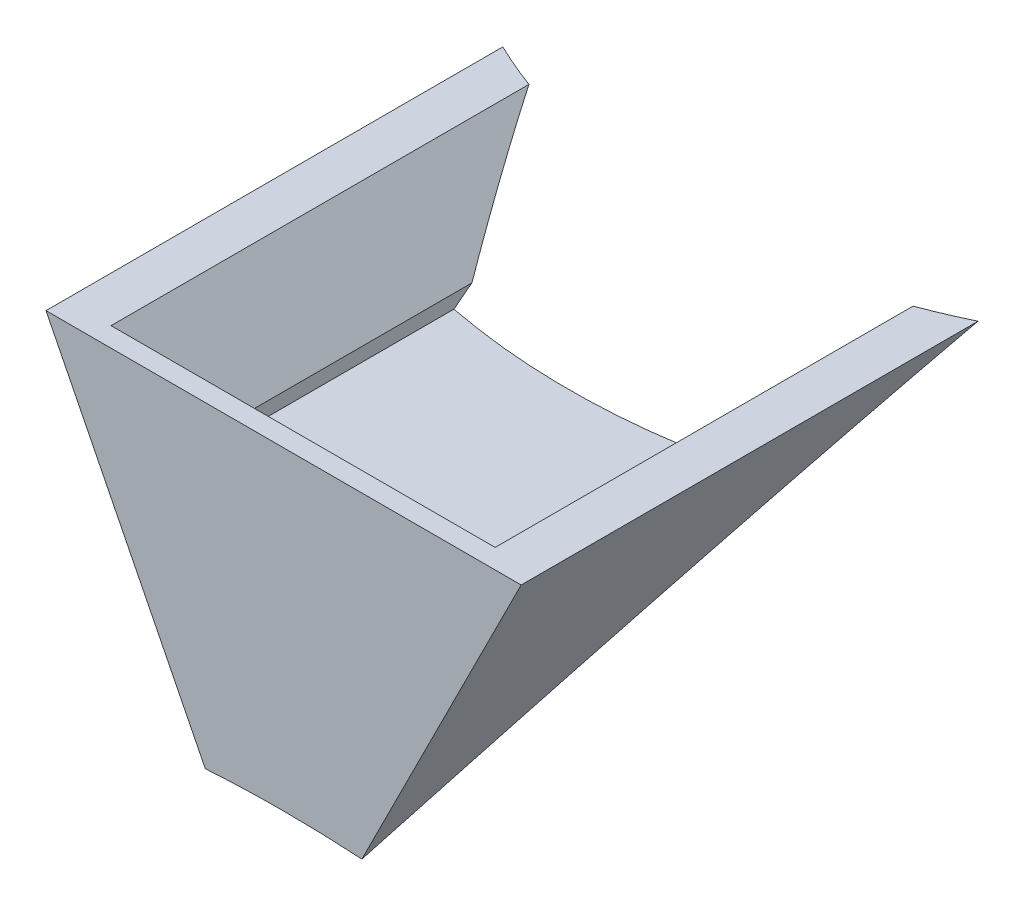
ISO-10303-21;
HEADER;
FILE_DESCRIPTION(('STEP AP214'),'2;1');
FILE_NAME('part.step','',(''),(''),'','','');
FILE_SCHEMA(('AUTOMOTIVE_DESIGN { 1 0 10303 214 1 1 1 1 }'));
ENDSEC;
DATA;
#1=APPLICATION_CONTEXT('core data for automotive mechanical design processes');
#2=APPLICATION_PROTOCOL_DEFINITION('international standard','automotive_design',2000,#1);
#3=PRODUCT_CONTEXT('',#1,'mechanical');
#4=PRODUCT('Part','Part','',(#3));
#5=PRODUCT_RELATED_PRODUCT_CATEGORY('part','',(#4));
#6=PRODUCT_DEFINITION_FORMATION('','',#4);
#7=PRODUCT_DEFINITION_CONTEXT('part definition',#1,'design');
#8=PRODUCT_DEFINITION('design','',#6,#7);
#9=PRODUCT_DEFINITION_SHAPE('','',#8);
#10=(LENGTH_UNIT() NAMED_UNIT(*) SI_UNIT(.MILLI.,.METRE.));
#11=(NAMED_UNIT(*) PLANE_ANGLE_UNIT() SI_UNIT($,.RADIAN.));
#12=(NAMED_UNIT(*) SI_UNIT($,.STERADIAN.) SOLID_ANGLE_UNIT());
#13=UNCERTAINTY_MEASURE_WITH_UNIT(LENGTH_MEASURE(1.E-05),#10,'distance_accuracy_value','');
#14=(GEOMETRIC_REPRESENTATION_CONTEXT(3) GLOBAL_UNCERTAINTY_ASSIGNED_CONTEXT((#13)) GLOBAL_UNIT_ASSIGNED_CONTEXT((#10,
#11,#12)) REPRESENTATION_CONTEXT('',''));
#15=CARTESIAN_POINT('',(0.,0.,0.));
#16=DIRECTION('',(0.,0.,1.));
#17=DIRECTION('',(1.,0.,0.));
#18=AXIS2_PLACEMENT_3D('',#15,#16,#17);
#19=CARTESIAN_POINT('',(36.5165123780825,61.1488138796035,74.4));
#20=DIRECTION('',(0.893572871010569,-0.44891817093311,0.));
#21=DIRECTION('',(0.44891817093311,0.893572871010569,0.));
#22=AXIS2_PLACEMENT_3D('',#19,#20,#21);
#23=PLANE('',#22);
#24=DIRECTION('',(0.44891817093311,0.893572871010569,0.));
#25=VECTOR('',#24,1.);
#26=CARTESIAN_POINT('',(36.5165123780825,61.1488138796035,146.));
#27=LINE('',#26,#25);
#28=CARTESIAN_POINT('',(12.0322438402475,12.4128090828477,146.));
#29=VERTEX_POINT('',#28);
#30=CARTESIAN_POINT('',(36.5165123780825,61.1488138796035,146.));
#31=VERTEX_POINT('',#30);
#32=EDGE_CURVE('E239',#29,#31,#27,.T.);
#33=ORIENTED_EDGE('',*,*,#32,.F.);
#34=CARTESIAN_POINT('',(12.0321680367807,12.4126581958356,146.0002));
#35=CARTESIAN_POINT('',(12.5688610544446,13.4809471440161,144.584175165571));
#36=CARTESIAN_POINT('',(13.1045962124579,14.5473294698912,143.166346857451));
#37=CARTESIAN_POINT('',(14.1739776630402,16.67593622915,140.326780206217));
#38=CARTESIAN_POINT('',(14.7076239496791,17.7381606507296,138.905041852021));
#39=CARTESIAN_POINT('',(15.7726581585626,19.8581142132651,136.05734215268));
#40=CARTESIAN_POINT('',(16.304046052333,20.9158432975426,134.631380754671));
#41=CARTESIAN_POINT('',(17.3643536281979,23.0263884838747,131.774914347619));
#42=CARTESIAN_POINT('',(17.8932733119516,24.0792045892317,130.34440934163));
#43=CARTESIAN_POINT('',(19.4753022142446,27.2282375305923,126.047437512643));
#44=CARTESIAN_POINT('',(20.5243921897442,29.3164540521178,123.173615521362));
#45=CARTESIAN_POINT('',(22.6097513121025,33.4673672000096,117.402880737035));
#46=CARTESIAN_POINT('',(23.6460202916624,35.5300634933671,114.505967643486));
#47=CARTESIAN_POINT('',(25.1889927466682,38.601354467497,110.139352616667));
#48=CARTESIAN_POINT('',(25.7015422874785,39.6215857576786,108.679894683172));
#49=CARTESIAN_POINT('',(26.7223170741325,41.6534408168525,105.753490729813));
#50=CARTESIAN_POINT('',(27.230542323348,42.6650645925567,104.286544715789));
#51=CARTESIAN_POINT('',(28.2421741587062,44.6787205816821,101.344530412456));
#52=CARTESIAN_POINT('',(28.7455809569398,45.6807532172711,99.8694624851887));
#53=CARTESIAN_POINT('',(29.747052352694,47.6741848230334,96.9103565123591));
#54=CARTESIAN_POINT('',(30.2451169651862,48.6655838230076,95.4263184919538));
#55=CARTESIAN_POINT('',(31.2356079436159,50.6371588774677,92.4473967751408));
#56=CARTESIAN_POINT('',(31.7280303323409,51.6173270153005,90.9525065120487));
#57=CARTESIAN_POINT('',(32.706165147445,53.5643070922068,87.9518899300106));
#58=CARTESIAN_POINT('',(33.191877643612,54.5311191701932,86.4461637240146));
#59=CARTESIAN_POINT('',(34.1558338999936,56.4498767864266,83.4225021751322));
#60=CARTESIAN_POINT('',(34.6340764118064,57.4018198397265,81.9045648543769));
#61=CARTESIAN_POINT('',(35.3450370599607,58.816988992328,79.617747034753));
#62=CARTESIAN_POINT('',(35.5809612917253,59.286596833509,78.8538074697439));
#63=CARTESIAN_POINT('',(36.050531589201,60.2212778199891,77.3224554309282));
#64=CARTESIAN_POINT('',(36.2841776406883,60.6863509369758,76.5550429354823));
#65=CARTESIAN_POINT('',(36.5166128552087,61.1490138796035,75.7858094345374));
#66=B_SPLINE_CURVE_WITH_KNOTS('',3,(#34,#35,#36,#37,#38,#39,#40,#41,#42,#43,#44,#45,#46,#47,#48,
#49,#50,#51,#52,#53,#54,#55,#56,#57,#58,#59,#60,#61,#62,#63,#64,#65),.UNSPECIFIED.,.F.,.F.,(4,2,
2,2,2,2,2,2,2,2,2,2,2,2,2,4),(0.,5.5596460292754,11.1193078307384,16.6790395231167,
22.2387674777242,33.3508071455111,44.4629916596974,50.0219486140888,55.5809012334323,
61.1396080317757,66.6982992477017,72.2606936289949,77.8230301136447,83.3862864520147,
86.1680230525511,88.94977700966),.UNSPECIFIED.);
#67=CARTESIAN_POINT('',(36.5165123780824,61.1488138796035,75.7861419614044));
#68=VERTEX_POINT('',#67);
#69=EDGE_CURVE('E205',#29,#68,#66,.T.);
#70=ORIENTED_EDGE('',*,*,#69,.T.);
#71=DIRECTION('',(0.,0.,1.));
#72=VECTOR('',#71,1.);
#73=CARTESIAN_POINT('',(36.5165123780825,61.1488138796035,74.4));
#74=LINE('',#73,#72);
#75=EDGE_CURVE('E49',#68,#31,#74,.T.);
#76=ORIENTED_EDGE('',*,*,#75,.T.);
#77=EDGE_LOOP('',(#33,#70,#76));
#78=FACE_BOUND('',#77,.T.);
#79=ADVANCED_FACE('F40',(#78),#23,.T.);
#80=CARTESIAN_POINT('',(-36.5165123780825,61.1488138796035,74.4));
#81=DIRECTION('',(-0.893572871010569,-0.44891817093311,0.));
#82=DIRECTION('',(0.44891817093311,-0.893572871010569,0.));
#83=AXIS2_PLACEMENT_3D('',#80,#81,#82);
#84=PLANE('',#83);
#85=DIRECTION('',(0.,0.,1.));
#86=VECTOR('',#85,1.);
#87=CARTESIAN_POINT('',(-36.5165123780825,61.1488138796035,74.4));
#88=LINE('',#87,#86);
#89=CARTESIAN_POINT('',(-36.5165123780824,61.1488138796035,75.7861419614044));
#90=VERTEX_POINT('',#89);
#91=CARTESIAN_POINT('',(-36.5165123780825,61.1488138796035,146.));
#92=VERTEX_POINT('',#91);
#93=EDGE_CURVE('E245',#90,#92,#88,.T.);
#94=ORIENTED_EDGE('',*,*,#93,.F.);
#95=CARTESIAN_POINT('',(-36.5166128552087,61.1490138796035,75.7858094345374));
#96=CARTESIAN_POINT('',(-36.2841776406883,60.6863509369758,76.5550429354823));
#97=CARTESIAN_POINT('',(-36.050531589201,60.2212778199891,77.3224554309282));
#98=CARTESIAN_POINT('',(-35.5809612917253,59.286596833509,78.8538074697439));
#99=CARTESIAN_POINT('',(-35.3450370599607,58.816988992328,79.617747034753));
#100=CARTESIAN_POINT('',(-34.6340764118064,57.4018198397265,81.9045648543769));
#101=CARTESIAN_POINT('',(-34.1558338999936,56.4498767864265,83.4225021751322));
#102=CARTESIAN_POINT('',(-33.191877643612,54.5311191701932,86.4461637240146));
#103=CARTESIAN_POINT('',(-32.706165147445,53.5643070922068,87.9518899300106));
#104=CARTESIAN_POINT('',(-31.7280303323409,51.6173270153005,90.9525065120487));
#105=CARTESIAN_POINT('',(-31.2356079436159,50.6371588774677,92.4473967751409));
#106=CARTESIAN_POINT('',(-30.2451169651862,48.6655838230076,95.4263184919538));
#107=CARTESIAN_POINT('',(-29.747052352694,47.6741848230334,96.9103565123591));
#108=CARTESIAN_POINT('',(-28.7455809569398,45.6807532172711,99.8694624851888));
#109=CARTESIAN_POINT('',(-28.2421741587062,44.6787205816821,101.344530412456));
#110=CARTESIAN_POINT('',(-27.230542323348,42.6650645925567,104.286544715789));
#111=CARTESIAN_POINT('',(-26.7223170741325,41.6534408168525,105.753490729813));
#112=CARTESIAN_POINT('',(-25.7015422874785,39.6215857576786,108.679894683172));
#113=CARTESIAN_POINT('',(-25.1889927466682,38.601354467497,110.139352616667));
#114=CARTESIAN_POINT('',(-23.6460202916624,35.5300634933671,114.505967643486));
#115=CARTESIAN_POINT('',(-22.6097513121025,33.4673672000096,117.402880737035));
#116=CARTESIAN_POINT('',(-20.5243921897442,29.3164540521178,123.173615521362));
#117=CARTESIAN_POINT('',(-19.4753022142446,27.2282375305923,126.047437512643));
#118=CARTESIAN_POINT('',(-17.8932733119516,24.0792045892317,130.34440934163));
#119=CARTESIAN_POINT('',(-17.3643536281979,23.0263884838747,131.774914347619));
#120=CARTESIAN_POINT('',(-16.304046052333,20.9158432975426,134.631380754671));
#121=CARTESIAN_POINT('',(-15.7726581585626,19.8581142132651,136.05734215268));
#122=CARTESIAN_POINT('',(-14.7076239496791,17.7381606507296,138.905041852021));
#123=CARTESIAN_POINT('',(-14.1739776630402,16.67593622915,140.326780206217));
#124=CARTESIAN_POINT('',(-13.1045962124579,14.5473294698912,143.166346857451));
#125=CARTESIAN_POINT('',(-12.5688610544446,13.4809471440161,144.584175165571));
#126=CARTESIAN_POINT('',(-12.0321680367807,12.4126581958356,146.0002));
#127=B_SPLINE_CURVE_WITH_KNOTS('',3,(#95,#96,#97,#98,#99,#100,#101,#102,#103,#104,#105,#106,
#107,#108,#109,#110,#111,#112,#113,#114,#115,#116,#117,#118,#119,#120,#121,#122,#123,#124,#125,
#126),.UNSPECIFIED.,.F.,.F.,(4,2,2,2,2,2,2,2,2,2,2,2,2,2,2,4),(0.,2.78175395710883,
5.56349055764522,11.1267468960152,16.689083380665,22.2514777619583,27.8101689778842,
33.3688757762276,38.9278283955712,44.4867853499626,55.5989698641489,66.7110095319357,
72.2707374865433,77.8304691789216,83.3901309803846,88.94977700966),.UNSPECIFIED.);
#128=CARTESIAN_POINT('',(-12.0322438402475,12.4128090828477,146.));
#129=VERTEX_POINT('',#128);
#130=EDGE_CURVE('E216',#90,#129,#127,.T.);
#131=ORIENTED_EDGE('',*,*,#130,.T.);
#132=DIRECTION('',(0.44891817093311,-0.893572871010569,0.));
#133=VECTOR('',#132,1.);
#134=CARTESIAN_POINT('',(-36.5165123780825,61.1488138796035,146.));
#135=LINE('',#134,#133);
#136=EDGE_CURVE('E243',#92,#129,#135,.T.);
#137=ORIENTED_EDGE('',*,*,#136,.F.);
#138=EDGE_LOOP('',(#94,#131,#137));
#139=FACE_BOUND('',#138,.T.);
#140=ADVANCED_FACE('F42',(#139),#84,.T.);
#141=CARTESIAN_POINT('',(0.,0.,146.));
#142=DIRECTION('',(0.,0.,1.));
#143=DIRECTION('',(1.,0.,0.));
#144=AXIS2_PLACEMENT_3D('',#141,#142,#143);
#145=PLANE('',#144);
#146=ORIENTED_EDGE('',*,*,#136,.T.);
#147=CARTESIAN_POINT('',(-101.235445651522,-11.9429442553645,146.));
#148=CARTESIAN_POINT('',(-99.7269255141927,-11.2712843398713,146.));
#149=CARTESIAN_POINT('',(-98.2146348679975,-10.6080609369352,146.));
#150=CARTESIAN_POINT('',(-95.1822341406342,-9.2996354057877,146.));
#151=CARTESIAN_POINT('',(-93.6621238600302,-8.65443373993697,146.));
#152=CARTESIAN_POINT('',(-90.6134850529939,-7.38306863157186,146.));
#153=CARTESIAN_POINT('',(-89.0849544334163,-6.75691020080287,146.));
#154=CARTESIAN_POINT('',(-86.0196831861346,-5.5250821414557,146.));
#155=CARTESIAN_POINT('',(-84.4829426124136,-4.91941237834947,146.));
#156=CARTESIAN_POINT('',(-79.8502611864355,-3.13130673170069,146.));
#157=CARTESIAN_POINT('',(-76.7414963606845,-1.98181090146236,146.));
#158=CARTESIAN_POINT('',(-70.4891658547942,0.217771821168926,146.));
#159=CARTESIAN_POINT('',(-67.3456027051401,1.26786588956297,146.));
#160=CARTESIAN_POINT('',(-61.0559960211285,3.24576189099809,146.));
#161=CARTESIAN_POINT('',(-57.9103186251433,4.17472257915209,146.));
#162=CARTESIAN_POINT('',(-51.5851273331574,5.91008633587676,146.));
#163=CARTESIAN_POINT('',(-48.4056125686174,6.71648625039304,146.));
#164=CARTESIAN_POINT('',(-42.0185507862757,8.19276707729138,146.));
#165=CARTESIAN_POINT('',(-38.8110398520496,8.86280255314277,146.));
#166=CARTESIAN_POINT('',(-33.979497110409,9.75694638090364,146.));
#167=CARTESIAN_POINT('',(-32.3655935692349,10.0365107925034,146.));
#168=CARTESIAN_POINT('',(-29.1316214868001,10.5572949190018,146.));
#169=CARTESIAN_POINT('',(-27.511553025052,10.7985151267437,146.));
#170=CARTESIAN_POINT('',(-23.2415317172124,11.381059860299,146.));
#171=CARTESIAN_POINT('',(-20.5870023666651,11.6894589256714,146.));
#172=CARTESIAN_POINT('',(-15.2675297798313,12.1960458132916,146.));
#173=CARTESIAN_POINT('',(-12.6025868390442,12.3942367402969,146.));
#174=CARTESIAN_POINT('',(-7.26624970408321,12.6773148955499,146.));
#175=CARTESIAN_POINT('',(-4.5948546113315,12.7621853071541,146.));
#176=CARTESIAN_POINT('',(0.749142105722115,12.8171773848548,146.));
#177=CARTESIAN_POINT('',(3.42174374075176,12.7872980097506,146.));
#178=CARTESIAN_POINT('',(8.7711414910762,12.6130212891526,146.));
#179=CARTESIAN_POINT('',(11.4479264875827,12.4682840727681,146.));
#180=CARTESIAN_POINT('',(16.7929636939864,12.0662197930451,146.));
#181=CARTESIAN_POINT('',(19.4612159798766,11.8088937352604,146.));
#182=CARTESIAN_POINT('',(24.784556250901,11.18570733156,146.));
#183=CARTESIAN_POINT('',(27.4396461012146,10.8198628377314,146.));
#184=CARTESIAN_POINT('',(32.7336167015871,9.98494686571263,146.));
#185=CARTESIAN_POINT('',(35.3724967520174,9.51587096370305,146.));
#186=CARTESIAN_POINT('',(40.0284826154804,8.59944414842753,146.));
#187=CARTESIAN_POINT('',(42.0494915976466,8.17174913616911,146.));
#188=CARTESIAN_POINT('',(46.0792484672925,7.26192826606441,146.));
#189=CARTESIAN_POINT('',(48.0879959299772,6.77980053357491,146.));
#190=CARTESIAN_POINT('',(54.0951687793045,5.25650928243711,146.));
#191=CARTESIAN_POINT('',(58.0742830877898,4.13848597820889,146.));
#192=CARTESIAN_POINT('',(65.9845531118227,1.72164690538786,146.));
#193=CARTESIAN_POINT('',(69.9156074422803,0.42250319668737,146.));
#194=CARTESIAN_POINT('',(77.7228779161781,-2.33017416972921,146.));
#195=CARTESIAN_POINT('',(81.5990970098757,-3.78369948529851,146.));
#196=CARTESIAN_POINT('',(87.3733662577268,-6.06280711722164,146.));
#197=CARTESIAN_POINT('',(89.2911876790609,-6.83886720137358,146.));
#198=CARTESIAN_POINT('',(93.1141829528185,-8.42153413166582,146.));
#199=CARTESIAN_POINT('',(95.0193569406113,-9.22814065023709,146.));
#200=CARTESIAN_POINT('',(98.8176422067613,-10.8696129769058,146.));
#201=CARTESIAN_POINT('',(100.710752554456,-11.7044809346382,146.));
#202=CARTESIAN_POINT('',(104.485248777022,-13.4002585720275,146.));
#203=CARTESIAN_POINT('',(106.366634738742,-14.2611680585018,146.));
#204=CARTESIAN_POINT('',(110.108942607947,-16.0027356458791,146.));
#205=CARTESIAN_POINT('',(111.969919687119,-16.8832753015152,146.));
#206=CARTESIAN_POINT('',(115.681297483109,-18.6663827265574,146.));
#207=CARTESIAN_POINT('',(117.531698135875,-19.5689506291953,146.));
#208=CARTESIAN_POINT('',(121.221899201266,-21.3941939740792,146.));
#209=CARTESIAN_POINT('',(123.06170244719,-22.316863693241,146.));
#210=CARTESIAN_POINT('',(126.731683053166,-24.1810479024655,146.));
#211=CARTESIAN_POINT('',(128.561860647996,-25.1225619301837,146.));
#212=CARTESIAN_POINT('',(130.387495482645,-26.0727668387425,146.));
#213=B_SPLINE_CURVE_WITH_KNOTS('',3,(#147,#148,#149,#150,#151,#152,#153,#154,#155,#156,#157,
#158,#159,#160,#161,#162,#163,#164,#165,#166,#167,#168,#169,#170,#171,#172,#173,#174,#175,#176,
#177,#178,#179,#180,#181,#182,#183,#184,#185,#186,#187,#188,#189,#190,#191,#192,#193,#194,#195,
#196,#197,#198,#199,#200,#201,#202,#203,#204,#205,#206,#207,#208,#209,#210,#211,#212),
.UNSPECIFIED.,.F.,.F.,(4,2,2,2,2,2,2,2,2,2,2,2,2,2,2,2,2,2,2,2,2,2,2,2,2,2,2,2,2,2,2,2,4),(0.,
4.95386351296243,9.9078540043481,14.8631371848483,19.8183878227702,29.7602195135498,
39.701332936464,49.5390097813912,59.3769397522985,69.2036559582686,74.1170739887055,
79.0304288612248,87.0452359389332,95.0598172139661,103.075587712171,111.091430942928,
119.13108235548,127.17066196574,135.209067753278,143.247818081141,149.444358297442,
155.641111985486,168.035357388622,180.452342764818,192.868657519246,199.075124821961,
205.281525587574,211.488399492812,217.695227365182,223.871420351261,230.047650701606,
236.222145052466,242.396488097561),.UNSPECIFIED.);
#214=EDGE_CURVE('E210',#129,#29,#213,.T.);
#215=ORIENTED_EDGE('',*,*,#214,.T.);
#216=ORIENTED_EDGE('',*,*,#32,.T.);
#217=DIRECTION('',(-1.,0.,0.));
#218=VECTOR('',#217,1.);
#219=CARTESIAN_POINT('',(0.,61.1488138796035,146.));
#220=LINE('',#219,#218);
#221=EDGE_CURVE('E242',#31,#92,#220,.T.);
#222=ORIENTED_EDGE('',*,*,#221,.T.);
#223=EDGE_LOOP('',(#146,#215,#216,#222));
#224=FACE_BOUND('',#223,.T.);
#225=ADVANCED_FACE('F222',(#224),#145,.T.);
#226=CARTESIAN_POINT('',(-19.487098975901,49.1363230869728,74.2));
#227=DIRECTION('',(-1.,0.,0.));
#228=DIRECTION('',(0.,0.,1.));
#229=AXIS2_PLACEMENT_3D('',#226,#227,#228);
#230=PLANE('',#229);
#231=CARTESIAN_POINT('',(-19.487098975901,78.1563062293105,59.236449826861));
#232=CARTESIAN_POINT('',(-19.487098975901,77.5261153437329,60.0854498763022));
#233=CARTESIAN_POINT('',(-19.487098975901,76.8950801668723,60.9338225551862));
#234=CARTESIAN_POINT('',(-19.487098975901,75.6314947866218,62.6294380032252));
#235=CARTESIAN_POINT('',(-19.487098975901,74.9989445843582,63.4766807732194));
#236=CARTESIAN_POINT('',(-19.487098975901,73.0992847851647,66.0168974487471));
#237=CARTESIAN_POINT('',(-19.487098975901,71.8301615954077,67.7083656431193));
#238=CARTESIAN_POINT('',(-19.487098975901,69.2876187220716,71.0880380398328));
#239=CARTESIAN_POINT('',(-19.487098975901,68.0141990872162,72.7762422788497));
#240=CARTESIAN_POINT('',(-19.487098975901,65.4638381843382,76.1499906840443));
#241=CARTESIAN_POINT('',(-19.487098975901,64.1868969127779,77.8355348475471));
#242=CARTESIAN_POINT('',(-19.487098975901,61.6301303141819,81.204383332828));
#243=CARTESIAN_POINT('',(-19.487098975901,60.3503050424662,82.8876876966005));
#244=CARTESIAN_POINT('',(-19.487098975901,57.7882200063138,86.2524429039457));
#245=CARTESIAN_POINT('',(-19.487098975901,56.5059602413441,87.9338937471126));
#246=CARTESIAN_POINT('',(-19.487098975901,52.6561066826786,92.9759161479314));
#247=CARTESIAN_POINT('',(-19.487098975901,50.0854469312803,96.3341466437141));
#248=CARTESIAN_POINT('',(-19.487098975901,44.3767647000313,103.778120563267));
#249=CARTESIAN_POINT('',(-19.487098975901,41.237303930421,107.862760437191));
#250=CARTESIAN_POINT('',(-19.487098975901,34.952108151018,116.027211218963));
#251=CARTESIAN_POINT('',(-19.487098975901,31.8063731385473,120.107022124747));
#252=CARTESIAN_POINT('',(-19.487098975901,25.5102754124458,128.26307209927));
#253=CARTESIAN_POINT('',(-19.487098975901,22.3599126978781,132.339311167285));
#254=CARTESIAN_POINT('',(-19.487098975901,16.0556804892631,140.489076790905));
#255=CARTESIAN_POINT('',(-19.487098975901,12.9018109949063,144.56260334627));
#256=CARTESIAN_POINT('',(-19.487098975901,6.59122151714518,152.707716339159));
#257=CARTESIAN_POINT('',(-19.487098975901,3.43450142161968,156.779302689804));
#258=CARTESIAN_POINT('',(-19.487098975901,-2.88109276417862,164.920804823749));
#259=CARTESIAN_POINT('',(-19.487098975901,-6.03996685460972,168.990720606925));
#260=CARTESIAN_POINT('',(-19.487098975901,-12.3594319577289,177.129193490062));
#261=CARTESIAN_POINT('',(-19.487098975901,-15.5200229636822,181.197750595253));
#262=CARTESIAN_POINT('',(-19.487098975901,-21.8426313178182,189.333755303868));
#263=CARTESIAN_POINT('',(-19.487098975901,-25.0046486657607,193.401202907479));
#264=CARTESIAN_POINT('',(-19.487098975901,-28.1672282805637,197.468213106563));
#265=B_SPLINE_CURVE_WITH_KNOTS('',3,(#231,#232,#233,#234,#235,#236,#237,#238,#239,#240,#241,
#242,#243,#244,#245,#246,#247,#248,#249,#250,#251,#252,#253,#254,#255,#256,#257,#258,#259,#260,
#261,#262,#263,#264),.UNSPECIFIED.,.F.,.F.,(4,2,2,2,2,2,2,2,2,2,2,2,2,2,2,2,4),(0.,
3.17198140364623,6.34396044991013,12.6878964056521,19.0317606583096,25.3756312861033,
31.7193812464243,38.0631325958425,50.7506764858875,66.2059090936675,81.6611483000004,
97.1163906358588,112.571634335535,128.027514996498,143.483396793393,158.939218394233,
174.395037392579),.UNSPECIFIED.);
#266=CARTESIAN_POINT('',(-19.487098975901,49.1363230869727,97.5709317566812));
#267=VERTEX_POINT('',#266);
#268=CARTESIAN_POINT('',(-19.487098975901,47.0213319904168,100.329598667714));
#269=VERTEX_POINT('',#268);
#270=EDGE_CURVE('E55',#267,#269,#265,.T.);
#271=ORIENTED_EDGE('',*,*,#270,.F.);
#272=DIRECTION('',(0.,0.,1.));
#273=VECTOR('',#272,1.);
#274=CARTESIAN_POINT('',(-19.487098975901,49.1363230869728,74.2));
#275=LINE('',#274,#273);
#276=CARTESIAN_POINT('',(-19.487098975901,49.1363230869728,143.));
#277=VERTEX_POINT('',#276);
#278=EDGE_CURVE('E248',#267,#277,#275,.T.);
#279=ORIENTED_EDGE('',*,*,#278,.T.);
#280=DIRECTION('',(0.,-1.,0.));
#281=VECTOR('',#280,1.);
#282=CARTESIAN_POINT('',(-19.487098975901,49.1363230869728,143.));
#283=LINE('',#282,#281);
#284=CARTESIAN_POINT('',(-19.487098975901,47.0213319904168,143.));
#285=VERTEX_POINT('',#284);
#286=EDGE_CURVE('E257',#277,#285,#283,.T.);
#287=ORIENTED_EDGE('',*,*,#286,.T.);
#288=DIRECTION('',(0.,0.,1.));
#289=VECTOR('',#288,1.);
#290=CARTESIAN_POINT('',(-19.487098975901,47.0213319904168,74.2));
#291=LINE('',#290,#289);
#292=EDGE_CURVE('E278',#269,#285,#291,.T.);
#293=ORIENTED_EDGE('',*,*,#292,.F.);
#294=EDGE_LOOP('',(#271,#279,#287,#293));
#295=FACE_BOUND('',#294,.T.);
#296=ADVANCED_FACE('F226',(#295),#230,.F.);
#297=CARTESIAN_POINT('',(-29.5165123781139,61.1488138795835,74.2));
#298=DIRECTION('',(-0.767623688512181,-0.640900829173246,0.));
#299=DIRECTION('',(0.640900829173246,-0.767623688512181,0.));
#300=AXIS2_PLACEMENT_3D('',#297,#298,#299);
#301=PLANE('',#300);
#302=CARTESIAN_POINT('',(-29.5166793611914,61.1490138795835,78.7763769512038));
#303=CARTESIAN_POINT('',(-29.1162450962017,60.6694032853913,79.5818620249337));
#304=CARTESIAN_POINT('',(-28.7132638004948,60.186742045881,80.3842526119776));
#305=CARTESIAN_POINT('',(-27.902494651338,59.2156626269162,81.9830870379457));
#306=CARTESIAN_POINT('',(-27.4947068488426,58.7272445084913,82.7795309397656));
#307=CARTESIAN_POINT('',(-26.2647706117741,57.2541177032861,85.1599085746357));
#308=CARTESIAN_POINT('',(-25.4358356786641,56.2612806496793,86.7353171619305));
#309=CARTESIAN_POINT('',(-23.7619357819605,54.2564069556238,89.8650797601419));
#310=CARTESIAN_POINT('',(-22.9169717334579,53.2443714112036,91.41943496435));
#311=CARTESIAN_POINT('',(-21.638646587056,51.7132879434778,93.7366832969033));
#312=CARTESIAN_POINT('',(-21.2106666103389,51.2006851297776,94.5068214963811));
#313=CARTESIAN_POINT('',(-20.3513048791141,50.1714051041301,96.0424554510079));
#314=CARTESIAN_POINT('',(-19.9199231456682,49.6547279174089,96.8079512348484));
#315=CARTESIAN_POINT('',(-19.4869319928235,49.1361230869728,97.5712261123492));
#316=B_SPLINE_CURVE_WITH_KNOTS('',3,(#302,#303,#304,#305,#306,#307,#308,#309,#310,#311,#312,
#313,#314,#315),.UNSPECIFIED.,.F.,.F.,(4,2,2,2,2,2,4),(0.,3.05817723988801,6.1163220886633,
12.2309822740365,18.3452944220146,21.4032749017773,24.4612364629934),.UNSPECIFIED.);
#317=CARTESIAN_POINT('',(-29.5165123781139,61.1488138795835,78.7767128451661));
#318=VERTEX_POINT('',#317);
#319=EDGE_CURVE('E200',#318,#267,#316,.T.);
#320=ORIENTED_EDGE('',*,*,#319,.F.);
#321=DIRECTION('',(0.,0.,1.));
#322=VECTOR('',#321,1.);
#323=CARTESIAN_POINT('',(-29.5165123781139,61.1488138795835,74.2));
#324=LINE('',#323,#322);
#325=CARTESIAN_POINT('',(-29.5165123781139,61.1488138795835,143.));
#326=VERTEX_POINT('',#325);
#327=EDGE_CURVE('E280',#318,#326,#324,.T.);
#328=ORIENTED_EDGE('',*,*,#327,.T.);
#329=DIRECTION('',(0.640900829173246,-0.767623688512181,0.));
#330=VECTOR('',#329,1.);
#331=CARTESIAN_POINT('',(-29.5165123781139,61.1488138795835,143.));
#332=LINE('',#331,#330);
#333=EDGE_CURVE('E275',#326,#277,#332,.T.);
#334=ORIENTED_EDGE('',*,*,#333,.T.);
#335=ORIENTED_EDGE('',*,*,#278,.F.);
#336=EDGE_LOOP('',(#320,#328,#334,#335));
#337=FACE_BOUND('',#336,.T.);
#338=ADVANCED_FACE('F307',(#337),#301,.F.);
#339=CARTESIAN_POINT('',(20.512901024099,49.1363230869728,74.2));
#340=DIRECTION('',(0.800184028833963,-0.59975454979437,0.));
#341=DIRECTION('',(0.59975454979437,0.800184028833963,0.));
#342=AXIS2_PLACEMENT_3D('',#339,#340,#341);
#343=PLANE('',#342);
#344=CARTESIAN_POINT('',(20.5127511199449,49.1361230869727,97.3607298917346));
#345=CARTESIAN_POINT('',(20.9001752747153,49.653018909002,96.6030785201092));
#346=CARTESIAN_POINT('',(21.2862942844788,50.1681734250417,95.8435730652123));
#347=CARTESIAN_POINT('',(22.0557706170823,51.1947978535286,94.3206768771763));
#348=CARTESIAN_POINT('',(22.439127926352,51.7062677478704,93.5572861249773));
#349=CARTESIAN_POINT('',(23.584665076525,53.2346271947786,91.2613509963163));
#350=CARTESIAN_POINT('',(24.3424720152406,54.2456824831591,89.7227275764417));
#351=CARTESIAN_POINT('',(25.8450342472187,56.2503797393452,86.6277274848075));
#352=CARTESIAN_POINT('',(26.589788959003,57.2440209313512,85.0713500271773));
#353=CARTESIAN_POINT('',(27.6959273366422,58.7198150937642,82.722149281497));
#354=CARTESIAN_POINT('',(28.062845106323,59.2093515871424,81.9365615318271));
#355=CARTESIAN_POINT('',(28.7927565498586,60.1831891008063,80.3603242862441));
#356=CARTESIAN_POINT('',(29.1557501900155,60.6674900761326,79.569674746956));
#357=CARTESIAN_POINT('',(29.5166622821685,61.1490138795835,78.7763833505318));
#358=B_SPLINE_CURVE_WITH_KNOTS('',3,(#344,#345,#346,#347,#348,#349,#350,#351,#352,#353,#354,
#355,#356,#357),.UNSPECIFIED.,.F.,.F.,(4,2,2,2,2,2,4),(0.,2.98693602881047,5.97388672469401,
11.9465410851712,17.9194608550667,20.906536681443,23.893638138708),.UNSPECIFIED.);
#359=CARTESIAN_POINT('',(20.512901024099,49.1363230869727,97.3604367386416));
#360=VERTEX_POINT('',#359);
#361=CARTESIAN_POINT('',(29.5165123780145,61.1488138795835,78.7767128452034));
#362=VERTEX_POINT('',#361);
#363=EDGE_CURVE('E170',#360,#362,#358,.T.);
#364=ORIENTED_EDGE('',*,*,#363,.F.);
#365=DIRECTION('',(0.,0.,1.));
#366=VECTOR('',#365,1.);
#367=CARTESIAN_POINT('',(20.512901024099,49.1363230869728,74.2));
#368=LINE('',#367,#366);
#369=CARTESIAN_POINT('',(20.512901024099,49.1363230869728,143.));
#370=VERTEX_POINT('',#369);
#371=EDGE_CURVE('E284',#360,#370,#368,.T.);
#372=ORIENTED_EDGE('',*,*,#371,.T.);
#373=DIRECTION('',(0.59975454979437,0.800184028833963,0.));
#374=VECTOR('',#373,1.);
#375=CARTESIAN_POINT('',(20.512901024099,49.1363230869728,143.));
#376=LINE('',#375,#374);
#377=CARTESIAN_POINT('',(29.5165123780145,61.1488138795835,143.));
#378=VERTEX_POINT('',#377);
#379=EDGE_CURVE('E269',#370,#378,#376,.T.);
#380=ORIENTED_EDGE('',*,*,#379,.T.);
#381=DIRECTION('',(0.,0.,1.));
#382=VECTOR('',#381,1.);
#383=CARTESIAN_POINT('',(29.5165123780145,61.1488138795835,74.2));
#384=LINE('',#383,#382);
#385=EDGE_CURVE('E282',#362,#378,#384,.T.);
#386=ORIENTED_EDGE('',*,*,#385,.F.);
#387=EDGE_LOOP('',(#364,#372,#380,#386));
#388=FACE_BOUND('',#387,.T.);
#389=ADVANCED_FACE('F302',(#388),#343,.F.);
#390=CARTESIAN_POINT('',(20.512901024099,47.0213319904168,74.2));
#391=DIRECTION('',(1.,0.,0.));
#392=DIRECTION('',(0.,0.,-1.));
#393=AXIS2_PLACEMENT_3D('',#390,#391,#392);
#394=PLANE('',#393);
#395=CARTESIAN_POINT('',(20.512901024099,-28.218647067918,197.43044808129));
#396=CARTESIAN_POINT('',(20.512901024099,-25.0570793123532,193.362610017783));
#397=CARTESIAN_POINT('',(20.512901024099,-21.8961344830809,189.294287595027));
#398=CARTESIAN_POINT('',(20.512901024099,-15.575824870243,181.1564142882));
#399=CARTESIAN_POINT('',(20.512901024099,-12.416460087004,177.086863403875));
#400=CARTESIAN_POINT('',(20.512901024099,-6.09963074270202,168.946255364324));
#401=CARTESIAN_POINT('',(20.512901024099,-2.94216619093241,164.875198201885));
#402=CARTESIAN_POINT('',(20.512901024099,3.37037669248469,156.731234709158));
#403=CARTESIAN_POINT('',(20.512901024099,6.52545502434752,152.658328379037));
#404=CARTESIAN_POINT('',(20.512901024099,12.8324408337832,144.510386857));
#405=CARTESIAN_POINT('',(20.512901024099,15.9843484620698,140.435351781761));
#406=CARTESIAN_POINT('',(20.512901024099,22.2842776512352,132.282279165927));
#407=CARTESIAN_POINT('',(20.512901024099,25.4322992125342,128.204241625657));
#408=CARTESIAN_POINT('',(20.512901024099,31.723224211753,120.044221382872));
#409=CARTESIAN_POINT('',(20.512901024099,34.8661276513202,115.962238681628));
#410=CARTESIAN_POINT('',(20.512901024099,39.5752519007281,109.835245245063));
#411=CARTESIAN_POINT('',(20.512901024099,41.1440878798061,107.792244575174));
#412=CARTESIAN_POINT('',(20.512901024099,44.2796850387283,103.704651972511));
#413=CARTESIAN_POINT('',(20.512901024099,45.8464462187009,101.660060039837));
#414=CARTESIAN_POINT('',(20.512901024099,49.9688706667085,96.2736999582489));
#415=CARTESIAN_POINT('',(20.512901024099,52.5224917637837,92.9303675462441));
#416=CARTESIAN_POINT('',(20.512901024099,56.3462177539069,87.9102718617089));
#417=CARTESIAN_POINT('',(20.512901024099,57.6196730240399,86.236060357747));
#418=CARTESIAN_POINT('',(20.512901024099,60.1639239395493,82.885617913739));
#419=CARTESIAN_POINT('',(20.512901024099,61.4347195856231,81.2093869742227));
#420=CARTESIAN_POINT('',(20.512901024099,63.973167396837,77.8544857222776));
#421=CARTESIAN_POINT('',(20.512901024099,65.2408194894516,76.1758153549598));
#422=CARTESIAN_POINT('',(20.512901024099,67.7722873689112,72.8155869288912));
#423=CARTESIAN_POINT('',(20.512901024099,69.0361031603073,71.1340288735699));
#424=CARTESIAN_POINT('',(20.512901024099,71.5590638007408,67.7673748647455));
#425=CARTESIAN_POINT('',(20.512901024099,72.8182085866764,66.0822788639257));
#426=CARTESIAN_POINT('',(20.512901024099,74.7025573706658,63.5513773239937));
#427=CARTESIAN_POINT('',(20.512901024099,75.3299468554661,62.707198810021));
#428=CARTESIAN_POINT('',(20.512901024099,76.5830835407122,61.017622670047));
#429=CARTESIAN_POINT('',(20.512901024099,77.2088307397237,60.1722250429821));
#430=CARTESIAN_POINT('',(20.512901024099,77.8336636092037,59.3261513879622));
#431=B_SPLINE_CURVE_WITH_KNOTS('',3,(#395,#396,#397,#398,#399,#400,#401,#402,#403,#404,#405,
#406,#407,#408,#409,#410,#411,#412,#413,#414,#415,#416,#417,#418,#419,#420,#421,#422,#423,#424,
#425,#426,#427,#428,#429,#430),.UNSPECIFIED.,.F.,.F.,(4,2,2,2,2,2,2,2,2,2,2,2,2,2,2,2,2,4),(0.,
15.4559166855888,30.9118365641812,46.3678314281489,61.8238248970821,77.2790452484522,
92.7342639282506,108.189477632194,115.917081664589,123.644685218307,136.265673154883,
142.576142771145,148.886610732213,155.197222953178,161.507827684652,167.818517359309,
170.973875210532,174.129235816886),.UNSPECIFIED.);
#432=CARTESIAN_POINT('',(20.512901024099,47.0213319904168,100.124903430149));
#433=VERTEX_POINT('',#432);
#434=EDGE_CURVE('E162',#433,#360,#431,.T.);
#435=ORIENTED_EDGE('',*,*,#434,.F.);
#436=DIRECTION('',(0.,0.,1.));
#437=VECTOR('',#436,1.);
#438=CARTESIAN_POINT('',(20.512901024099,47.0213319904168,74.2));
#439=LINE('',#438,#437);
#440=CARTESIAN_POINT('',(20.512901024099,47.0213319904168,143.));
#441=VERTEX_POINT('',#440);
#442=EDGE_CURVE('E286',#433,#441,#439,.T.);
#443=ORIENTED_EDGE('',*,*,#442,.T.);
#444=DIRECTION('',(0.,1.,0.));
#445=VECTOR('',#444,1.);
#446=CARTESIAN_POINT('',(20.512901024099,47.0213319904168,143.));
#447=LINE('',#446,#445);
#448=EDGE_CURVE('E264',#441,#370,#447,.T.);
#449=ORIENTED_EDGE('',*,*,#448,.T.);
#450=ORIENTED_EDGE('',*,*,#371,.F.);
#451=EDGE_LOOP('',(#435,#443,#449,#450));
#452=FACE_BOUND('',#451,.T.);
#453=ADVANCED_FACE('F176',(#452),#394,.F.);
#454=CARTESIAN_POINT('',(0.,61.1488138796035,74.4));
#455=DIRECTION('',(0.,1.,0.));
#456=DIRECTION('',(0.,0.,1.));
#457=AXIS2_PLACEMENT_3D('',#454,#455,#456);
#458=PLANE('',#457);
#459=ORIENTED_EDGE('',*,*,#327,.F.);
#460=CARTESIAN_POINT('',(0.,61.1488138796035,0.));
#461=DIRECTION('',(0.,1.,0.));
#462=DIRECTION('',(0.,0.,1.));
#463=AXIS2_PLACEMENT_3D('',#460,#461,#462);
#464=CIRCLE('',#463,84.1248773529732);
#465=EDGE_CURVE('E217',#318,#90,#464,.F.);
#466=ORIENTED_EDGE('',*,*,#465,.T.);
#467=ORIENTED_EDGE('',*,*,#93,.T.);
#468=ORIENTED_EDGE('',*,*,#221,.F.);
#469=ORIENTED_EDGE('',*,*,#75,.F.);
#470=EDGE_CURVE('E303',#68,#362,#464,.F.);
#471=ORIENTED_EDGE('',*,*,#470,.T.);
#472=ORIENTED_EDGE('',*,*,#385,.T.);
#473=DIRECTION('',(-1.,0.,0.));
#474=VECTOR('',#473,1.);
#475=CARTESIAN_POINT('',(29.5165123780145,61.1488138795835,143.));
#476=LINE('',#475,#474);
#477=EDGE_CURVE('E272',#378,#326,#476,.T.);
#478=ORIENTED_EDGE('',*,*,#477,.T.);
#479=EDGE_LOOP('',(#459,#466,#467,#468,#469,#471,#472,#478));
#480=FACE_BOUND('',#479,.T.);
#481=ADVANCED_FACE('F229',(#480),#458,.T.);
#482=CARTESIAN_POINT('',(-19.487098975901,47.0213319904168,74.2));
#483=DIRECTION('',(0.,-1.,0.));
#484=DIRECTION('',(0.,0.,-1.));
#485=AXIS2_PLACEMENT_3D('',#482,#483,#484);
#486=PLANE('',#485);
#487=CARTESIAN_POINT('',(0.,47.0213319904168,0.));
#488=DIRECTION('',(0.,-1.,0.));
#489=DIRECTION('',(0.,0.,-1.));
#490=AXIS2_PLACEMENT_3D('',#487,#488,#489);
#491=CIRCLE('',#490,102.204576195595);
#492=EDGE_CURVE('E11',#269,#433,#491,.F.);
#493=ORIENTED_EDGE('',*,*,#492,.F.);
#494=ORIENTED_EDGE('',*,*,#292,.T.);
#495=DIRECTION('',(1.,0.,0.));
#496=VECTOR('',#495,1.);
#497=CARTESIAN_POINT('',(-19.487098975901,47.0213319904168,143.));
#498=LINE('',#497,#496);
#499=EDGE_CURVE('E259',#285,#441,#498,.T.);
#500=ORIENTED_EDGE('',*,*,#499,.T.);
#501=ORIENTED_EDGE('',*,*,#442,.F.);
#502=EDGE_LOOP('',(#493,#494,#500,#501));
#503=FACE_BOUND('',#502,.T.);
#504=ADVANCED_FACE('F231',(#503),#486,.F.);
#505=CARTESIAN_POINT('',(0.,0.,143.));
#506=DIRECTION('',(0.,0.,1.));
#507=DIRECTION('',(1.,0.,0.));
#508=AXIS2_PLACEMENT_3D('',#505,#506,#507);
#509=PLANE('',#508);
#510=ORIENTED_EDGE('',*,*,#286,.F.);
#511=ORIENTED_EDGE('',*,*,#333,.F.);
#512=ORIENTED_EDGE('',*,*,#477,.F.);
#513=ORIENTED_EDGE('',*,*,#379,.F.);
#514=ORIENTED_EDGE('',*,*,#448,.F.);
#515=ORIENTED_EDGE('',*,*,#499,.F.);
#516=EDGE_LOOP('',(#510,#511,#512,#513,#514,#515));
#517=FACE_BOUND('',#516,.T.);
#518=ADVANCED_FACE('F184',(#517),#509,.F.);
#519=CARTESIAN_POINT('',(0.,8.18005228522126,0.));
#520=DIRECTION('',(0.,-1.,0.));
#521=DIRECTION('',(0.,0.,-1.));
#522=AXIS2_PLACEMENT_3D('',#519,#520,#521);
#523=CONICAL_SURFACE('',#522,151.911852073929,0.907500014461163);
#524=ORIENTED_EDGE('',*,*,#465,.F.);
#525=ORIENTED_EDGE('',*,*,#319,.T.);
#526=ORIENTED_EDGE('',*,*,#270,.T.);
#527=ORIENTED_EDGE('',*,*,#492,.T.);
#528=ORIENTED_EDGE('',*,*,#434,.T.);
#529=ORIENTED_EDGE('',*,*,#363,.T.);
#530=ORIENTED_EDGE('',*,*,#470,.F.);
#531=ORIENTED_EDGE('',*,*,#69,.F.);
#532=ORIENTED_EDGE('',*,*,#214,.F.);
#533=ORIENTED_EDGE('',*,*,#130,.F.);
#534=EDGE_LOOP('',(#524,#525,#526,#527,#528,#529,#530,#531,#532,#533));
#535=FACE_BOUND('',#534,.T.);
#536=ADVANCED_FACE('F179',(#535),#523,.F.);
#537=CLOSED_SHELL('',(#79,#140,#225,#296,#338,#389,#453,#481,#504,#518,#536));
#538=CARTESIAN_POINT('',(-12.75,42.6783214431934,113.038923411898));
#539=DIRECTION('',(0.,1.,0.));
#540=DIRECTION('',(0.,0.,1.));
#541=AXIS2_PLACEMENT_3D('',#538,#539,#540);
#542=PLANE('',#541);
#543=DIRECTION('',(0.,0.,1.));
#544=VECTOR('',#543,1.);
#545=CARTESIAN_POINT('',(12.75,42.6783214431934,113.038923411898));
#546=LINE('',#545,#544);
#547=CARTESIAN_POINT('',(12.75,42.6783214431934,113.038923411898));
#548=VERTEX_POINT('',#547);
#549=CARTESIAN_POINT('',(12.75,42.6783214431934,140.809307474774));
#550=VERTEX_POINT('',#549);
#551=EDGE_CURVE('E137',#548,#550,#546,.T.);
#552=ORIENTED_EDGE('',*,*,#551,.T.);
#553=DIRECTION('',(1.,0.,0.));
#554=VECTOR('',#553,1.);
#555=CARTESIAN_POINT('',(-12.75,42.6783214431934,140.809307474774));
#556=LINE('',#555,#554);
#557=CARTESIAN_POINT('',(-12.75,42.6783214431934,140.809307474774));
#558=VERTEX_POINT('',#557);
#559=EDGE_CURVE('E130',#558,#550,#556,.T.);
#560=ORIENTED_EDGE('',*,*,#559,.F.);
#561=DIRECTION('',(0.,0.,1.));
#562=VECTOR('',#561,1.);
#563=CARTESIAN_POINT('',(-12.75,42.6783214431934,113.038923411898));
#564=LINE('',#563,#562);
#565=CARTESIAN_POINT('',(-12.75,42.6783214431934,113.038923411898));
#566=VERTEX_POINT('',#565);
#567=EDGE_CURVE('E134',#566,#558,#564,.T.);
#568=ORIENTED_EDGE('',*,*,#567,.F.);
#569=DIRECTION('',(1.,0.,0.));
#570=VECTOR('',#569,1.);
#571=CARTESIAN_POINT('',(-12.75,42.6783214431934,113.038923411898));
#572=LINE('',#571,#570);
#573=EDGE_CURVE('E160',#566,#548,#572,.T.);
#574=ORIENTED_EDGE('',*,*,#573,.T.);
#575=EDGE_LOOP('',(#552,#560,#568,#574));
#576=FACE_BOUND('',#575,.T.);
#577=ADVANCED_FACE('F132',(#576),#542,.F.);
#578=CARTESIAN_POINT('',(-12.75,21.4774567741327,140.809307474774));
#579=DIRECTION('',(0.,-0.794845265095219,-0.606812165794087));
#580=DIRECTION('',(0.,0.606812165794087,-0.794845265095219));
#581=AXIS2_PLACEMENT_3D('',#578,#579,#580);
#582=PLANE('',#581);
#583=DIRECTION('',(0.,0.606812165794087,-0.794845265095219));
#584=VECTOR('',#583,1.);
#585=CARTESIAN_POINT('',(12.75,21.4774567741327,140.809307474774));
#586=LINE('',#585,#584);
#587=CARTESIAN_POINT('',(12.75,21.4774567741327,140.809307474774));
#588=VERTEX_POINT('',#587);
#589=EDGE_CURVE('E151',#588,#548,#586,.T.);
#590=ORIENTED_EDGE('',*,*,#589,.T.);
#591=ORIENTED_EDGE('',*,*,#573,.F.);
#592=DIRECTION('',(0.,0.606812165794087,-0.794845265095219));
#593=VECTOR('',#592,1.);
#594=CARTESIAN_POINT('',(-12.75,21.4774567741327,140.809307474774));
#595=LINE('',#594,#593);
#596=CARTESIAN_POINT('',(-12.75,21.4774567741327,140.809307474774));
#597=VERTEX_POINT('',#596);
#598=EDGE_CURVE('E142',#597,#566,#595,.T.);
#599=ORIENTED_EDGE('',*,*,#598,.F.);
#600=DIRECTION('',(1.,0.,0.));
#601=VECTOR('',#600,1.);
#602=CARTESIAN_POINT('',(-12.75,21.4774567741327,140.809307474774));
#603=LINE('',#602,#601);
#604=EDGE_CURVE('E141',#597,#588,#603,.T.);
#605=ORIENTED_EDGE('',*,*,#604,.T.);
#606=EDGE_LOOP('',(#590,#591,#599,#605));
#607=FACE_BOUND('',#606,.T.);
#608=ADVANCED_FACE('F353',(#607),#582,.F.);
#609=CARTESIAN_POINT('',(-12.75,42.6783214431934,140.809307474774));
#610=DIRECTION('',(0.,0.,1.));
#611=DIRECTION('',(1.,0.,0.));
#612=AXIS2_PLACEMENT_3D('',#609,#610,#611);
#613=PLANE('',#612);
#614=DIRECTION('',(0.,-1.,0.));
#615=VECTOR('',#614,1.);
#616=CARTESIAN_POINT('',(12.75,42.6783214431934,140.809307474774));
#617=LINE('',#616,#615);
#618=EDGE_CURVE('E154',#550,#588,#617,.T.);
#619=ORIENTED_EDGE('',*,*,#618,.T.);
#620=ORIENTED_EDGE('',*,*,#604,.F.);
#621=DIRECTION('',(0.,-1.,0.));
#622=VECTOR('',#621,1.);
#623=CARTESIAN_POINT('',(-12.75,42.6783214431934,140.809307474774));
#624=LINE('',#623,#622);
#625=EDGE_CURVE('E145',#558,#597,#624,.T.);
#626=ORIENTED_EDGE('',*,*,#625,.F.);
#627=ORIENTED_EDGE('',*,*,#559,.T.);
#628=EDGE_LOOP('',(#619,#620,#626,#627));
#629=FACE_BOUND('',#628,.T.);
#630=ADVANCED_FACE('F146',(#629),#613,.F.);
#631=CARTESIAN_POINT('',(-12.75,0.,0.));
#632=DIRECTION('',(1.,0.,0.));
#633=DIRECTION('',(0.,0.,-1.));
#634=AXIS2_PLACEMENT_3D('',#631,#632,#633);
#635=PLANE('',#634);
#636=ORIENTED_EDGE('',*,*,#567,.T.);
#637=ORIENTED_EDGE('',*,*,#625,.T.);
#638=ORIENTED_EDGE('',*,*,#598,.T.);
#639=EDGE_LOOP('',(#636,#637,#638));
#640=FACE_BOUND('',#639,.T.);
#641=ADVANCED_FACE('F150',(#640),#635,.T.);
#642=CARTESIAN_POINT('',(12.75,0.,0.));
#643=DIRECTION('',(1.,0.,0.));
#644=DIRECTION('',(0.,0.,-1.));
#645=AXIS2_PLACEMENT_3D('',#642,#643,#644);
#646=PLANE('',#645);
#647=ORIENTED_EDGE('',*,*,#551,.F.);
#648=ORIENTED_EDGE('',*,*,#589,.F.);
#649=ORIENTED_EDGE('',*,*,#618,.F.);
#650=EDGE_LOOP('',(#647,#648,#649));
#651=FACE_BOUND('',#650,.T.);
#652=ADVANCED_FACE('F372',(#651),#646,.F.);
#653=CLOSED_SHELL('',(#577,#608,#630,#641,#652));
#654=ORIENTED_CLOSED_SHELL('',*,#653,.T.);
#655=BREP_WITH_VOIDS('B2',#537,(#654));
#656=ADVANCED_BREP_SHAPE_REPRESENTATION('',(#18,#655),#14);
#657=SHAPE_DEFINITION_REPRESENTATION(#9,#656);
ENDSEC;
END-ISO-10303-21;
